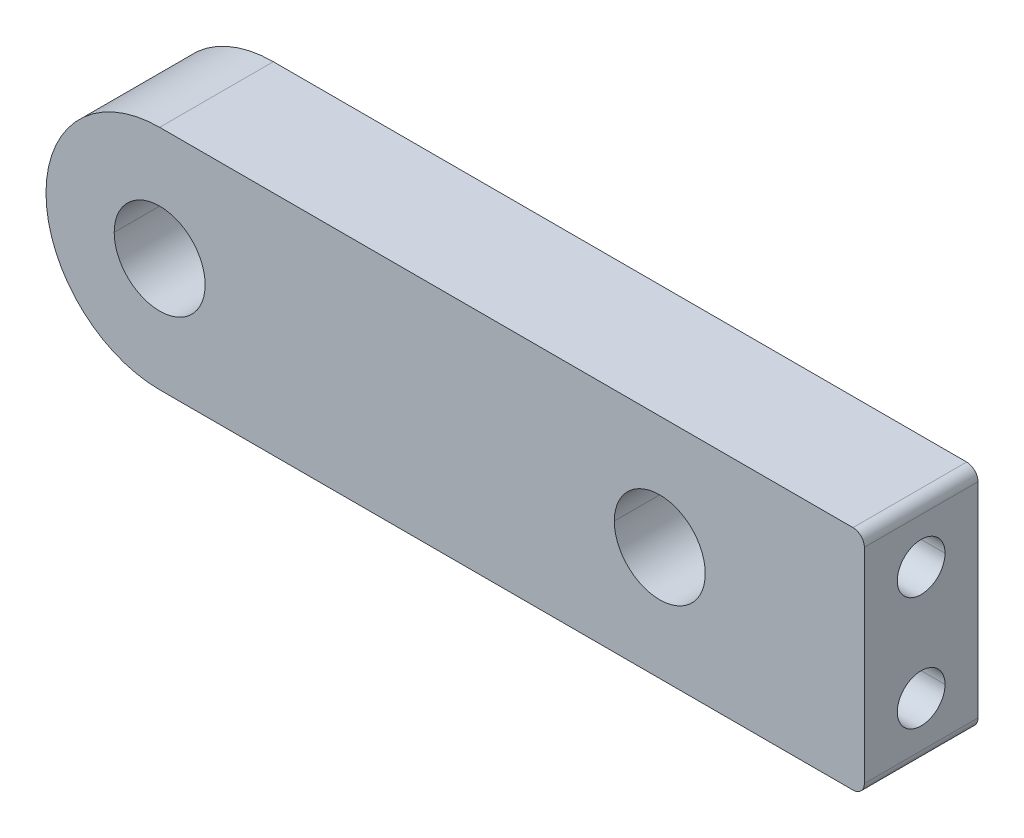
ISO-10303-21;
HEADER;
FILE_DESCRIPTION(('STEP AP214'),'2;1');
FILE_NAME('part.step','',(''),(''),'','','');
FILE_SCHEMA(('AUTOMOTIVE_DESIGN { 1 0 10303 214 1 1 1 1 }'));
ENDSEC;
DATA;
#1=APPLICATION_CONTEXT('core data for automotive mechanical design processes');
#2=APPLICATION_PROTOCOL_DEFINITION('international standard','automotive_design',2000,#1);
#3=PRODUCT_CONTEXT('',#1,'mechanical');
#4=PRODUCT('Part','Part','',(#3));
#5=PRODUCT_RELATED_PRODUCT_CATEGORY('part','',(#4));
#6=PRODUCT_DEFINITION_FORMATION('','',#4);
#7=PRODUCT_DEFINITION_CONTEXT('part definition',#1,'design');
#8=PRODUCT_DEFINITION('design','',#6,#7);
#9=PRODUCT_DEFINITION_SHAPE('','',#8);
#10=(LENGTH_UNIT() NAMED_UNIT(*) SI_UNIT(.MILLI.,.METRE.));
#11=(NAMED_UNIT(*) PLANE_ANGLE_UNIT() SI_UNIT($,.RADIAN.));
#12=(NAMED_UNIT(*) SI_UNIT($,.STERADIAN.) SOLID_ANGLE_UNIT());
#13=UNCERTAINTY_MEASURE_WITH_UNIT(LENGTH_MEASURE(1.E-05),#10,'distance_accuracy_value','');
#14=(GEOMETRIC_REPRESENTATION_CONTEXT(3) GLOBAL_UNCERTAINTY_ASSIGNED_CONTEXT((#13)) GLOBAL_UNIT_ASSIGNED_CONTEXT((#10,
#11,#12)) REPRESENTATION_CONTEXT('',''));
#15=CARTESIAN_POINT('',(0.,0.,0.));
#16=DIRECTION('',(0.,0.,1.));
#17=DIRECTION('',(1.,0.,0.));
#18=AXIS2_PLACEMENT_3D('',#15,#16,#17);
#19=CARTESIAN_POINT('',(71.,19.,10.));
#20=DIRECTION('',(0.,0.,-1.));
#21=DIRECTION('',(-1.,0.,0.));
#22=AXIS2_PLACEMENT_3D('',#19,#20,#21);
#23=CYLINDRICAL_SURFACE('',#22,1.);
#24=CARTESIAN_POINT('',(71.,19.,10.));
#25=DIRECTION('',(0.,0.,1.));
#26=DIRECTION('',(1.,0.,0.));
#27=AXIS2_PLACEMENT_3D('',#24,#25,#26);
#28=CIRCLE('',#27,1.);
#29=CARTESIAN_POINT('',(72.,19.,10.));
#30=VERTEX_POINT('',#29);
#31=CARTESIAN_POINT('',(71.,20.,10.));
#32=VERTEX_POINT('',#31);
#33=EDGE_CURVE('E256',#30,#32,#28,.T.);
#34=ORIENTED_EDGE('',*,*,#33,.F.);
#35=DIRECTION('',(0.,0.,1.));
#36=VECTOR('',#35,1.);
#37=CARTESIAN_POINT('',(72.,19.,10.));
#38=LINE('',#37,#36);
#39=CARTESIAN_POINT('',(72.,19.,0.));
#40=VERTEX_POINT('',#39);
#41=EDGE_CURVE('E218',#40,#30,#38,.T.);
#42=ORIENTED_EDGE('',*,*,#41,.F.);
#43=CARTESIAN_POINT('',(71.,19.,0.));
#44=DIRECTION('',(0.,0.,-1.));
#45=DIRECTION('',(1.,0.,0.));
#46=AXIS2_PLACEMENT_3D('',#43,#44,#45);
#47=CIRCLE('',#46,1.);
#48=CARTESIAN_POINT('',(71.,20.,0.));
#49=VERTEX_POINT('',#48);
#50=EDGE_CURVE('E275',#49,#40,#47,.T.);
#51=ORIENTED_EDGE('',*,*,#50,.F.);
#52=DIRECTION('',(0.,0.,-1.));
#53=VECTOR('',#52,1.);
#54=CARTESIAN_POINT('',(71.,20.,10.));
#55=LINE('',#54,#53);
#56=EDGE_CURVE('E196',#32,#49,#55,.T.);
#57=ORIENTED_EDGE('',*,*,#56,.F.);
#58=EDGE_LOOP('',(#34,#42,#51,#57));
#59=FACE_BOUND('',#58,.T.);
#60=ADVANCED_FACE('F17',(#59),#23,.T.);
#61=CARTESIAN_POINT('',(71.,1.,10.));
#62=DIRECTION('',(0.,0.,1.));
#63=DIRECTION('',(1.,0.,0.));
#64=AXIS2_PLACEMENT_3D('',#61,#62,#63);
#65=CYLINDRICAL_SURFACE('',#64,1.);
#66=CARTESIAN_POINT('',(71.,1.,10.));
#67=DIRECTION('',(0.,0.,1.));
#68=DIRECTION('',(1.,0.,0.));
#69=AXIS2_PLACEMENT_3D('',#66,#67,#68);
#70=CIRCLE('',#69,1.);
#71=CARTESIAN_POINT('',(71.,0.,10.));
#72=VERTEX_POINT('',#71);
#73=CARTESIAN_POINT('',(72.,1.,10.));
#74=VERTEX_POINT('',#73);
#75=EDGE_CURVE('E255',#72,#74,#70,.T.);
#76=ORIENTED_EDGE('',*,*,#75,.F.);
#77=DIRECTION('',(0.,0.,1.));
#78=VECTOR('',#77,1.);
#79=CARTESIAN_POINT('',(71.,0.,10.));
#80=LINE('',#79,#78);
#81=CARTESIAN_POINT('',(71.,0.,0.));
#82=VERTEX_POINT('',#81);
#83=EDGE_CURVE('E243',#82,#72,#80,.T.);
#84=ORIENTED_EDGE('',*,*,#83,.F.);
#85=CARTESIAN_POINT('',(71.,1.,0.));
#86=DIRECTION('',(0.,0.,-1.));
#87=DIRECTION('',(1.,0.,0.));
#88=AXIS2_PLACEMENT_3D('',#85,#86,#87);
#89=CIRCLE('',#88,1.);
#90=CARTESIAN_POINT('',(72.,1.,0.));
#91=VERTEX_POINT('',#90);
#92=EDGE_CURVE('E266',#91,#82,#89,.T.);
#93=ORIENTED_EDGE('',*,*,#92,.F.);
#94=DIRECTION('',(0.,0.,-1.));
#95=VECTOR('',#94,1.);
#96=CARTESIAN_POINT('',(72.,1.,0.));
#97=LINE('',#96,#95);
#98=EDGE_CURVE('E209',#74,#91,#97,.T.);
#99=ORIENTED_EDGE('',*,*,#98,.F.);
#100=EDGE_LOOP('',(#76,#84,#93,#99));
#101=FACE_BOUND('',#100,.T.);
#102=ADVANCED_FACE('F323',(#101),#65,.T.);
#103=CARTESIAN_POINT('',(72.,15.,5.));
#104=DIRECTION('',(1.,0.,0.));
#105=DIRECTION('',(0.,0.,-1.));
#106=AXIS2_PLACEMENT_3D('',#103,#104,#105);
#107=CYLINDRICAL_SURFACE('',#106,2.1);
#108=DIRECTION('',(1.,0.,0.));
#109=VECTOR('',#108,1.);
#110=CARTESIAN_POINT('',(72.,15.,7.1));
#111=LINE('',#110,#109);
#112=CARTESIAN_POINT('',(58.,15.,7.1));
#113=VERTEX_POINT('',#112);
#114=CARTESIAN_POINT('',(72.,15.,7.1));
#115=VERTEX_POINT('',#114);
#116=EDGE_CURVE('E352',#113,#115,#111,.T.);
#117=ORIENTED_EDGE('',*,*,#116,.F.);
#118=CARTESIAN_POINT('',(58.,15.,5.));
#119=DIRECTION('',(1.,0.,0.));
#120=DIRECTION('',(0.,0.,-1.));
#121=AXIS2_PLACEMENT_3D('',#118,#119,#120);
#122=CIRCLE('',#121,2.1);
#123=CARTESIAN_POINT('',(58.,15.,2.9));
#124=VERTEX_POINT('',#123);
#125=EDGE_CURVE('E11',#124,#113,#122,.T.);
#126=ORIENTED_EDGE('',*,*,#125,.F.);
#127=DIRECTION('',(1.,0.,0.));
#128=VECTOR('',#127,1.);
#129=CARTESIAN_POINT('',(72.,15.,2.9));
#130=LINE('',#129,#128);
#131=CARTESIAN_POINT('',(72.,15.,2.9));
#132=VERTEX_POINT('',#131);
#133=EDGE_CURVE('E302',#124,#132,#130,.T.);
#134=ORIENTED_EDGE('',*,*,#133,.T.);
#135=CARTESIAN_POINT('',(72.,15.,5.));
#136=DIRECTION('',(1.,0.,0.));
#137=DIRECTION('',(0.,0.,-1.));
#138=AXIS2_PLACEMENT_3D('',#135,#136,#137);
#139=CIRCLE('',#138,2.1);
#140=EDGE_CURVE('E222',#132,#115,#139,.T.);
#141=ORIENTED_EDGE('',*,*,#140,.T.);
#142=EDGE_LOOP('',(#117,#126,#134,#141));
#143=FACE_BOUND('',#142,.T.);
#144=ADVANCED_FACE('F389',(#143),#107,.F.);
#145=CARTESIAN_POINT('',(58.,15.,5.));
#146=DIRECTION('',(-1.,0.,0.));
#147=DIRECTION('',(0.,0.,1.));
#148=AXIS2_PLACEMENT_3D('',#145,#146,#147);
#149=PLANE('',#148);
#150=ORIENTED_EDGE('',*,*,#125,.T.);
#151=CARTESIAN_POINT('',(58.,15.,5.));
#152=DIRECTION('',(1.,0.,0.));
#153=DIRECTION('',(0.,0.,-1.));
#154=AXIS2_PLACEMENT_3D('',#151,#152,#153);
#155=CIRCLE('',#154,2.1);
#156=EDGE_CURVE('E351',#113,#124,#155,.T.);
#157=ORIENTED_EDGE('',*,*,#156,.T.);
#158=EDGE_LOOP('',(#150,#157));
#159=FACE_BOUND('',#158,.T.);
#160=ADVANCED_FACE('F515',(#159),#149,.F.);
#161=CARTESIAN_POINT('',(72.,5.,5.));
#162=DIRECTION('',(1.,0.,0.));
#163=DIRECTION('',(0.,0.,-1.));
#164=AXIS2_PLACEMENT_3D('',#161,#162,#163);
#165=CYLINDRICAL_SURFACE('',#164,2.1);
#166=DIRECTION('',(1.,0.,0.));
#167=VECTOR('',#166,1.);
#168=CARTESIAN_POINT('',(72.,5.,7.1));
#169=LINE('',#168,#167);
#170=CARTESIAN_POINT('',(58.,5.,7.1));
#171=VERTEX_POINT('',#170);
#172=CARTESIAN_POINT('',(72.,5.,7.1));
#173=VERTEX_POINT('',#172);
#174=EDGE_CURVE('E293',#171,#173,#169,.T.);
#175=ORIENTED_EDGE('',*,*,#174,.F.);
#176=CARTESIAN_POINT('',(58.,5.,5.));
#177=DIRECTION('',(1.,0.,0.));
#178=DIRECTION('',(0.,0.,-1.));
#179=AXIS2_PLACEMENT_3D('',#176,#177,#178);
#180=CIRCLE('',#179,2.1);
#181=CARTESIAN_POINT('',(58.,5.,2.9));
#182=VERTEX_POINT('',#181);
#183=EDGE_CURVE('E20',#182,#171,#180,.T.);
#184=ORIENTED_EDGE('',*,*,#183,.F.);
#185=DIRECTION('',(1.,0.,0.));
#186=VECTOR('',#185,1.);
#187=CARTESIAN_POINT('',(72.,5.,2.9));
#188=LINE('',#187,#186);
#189=CARTESIAN_POINT('',(72.,5.,2.9));
#190=VERTEX_POINT('',#189);
#191=EDGE_CURVE('E184',#182,#190,#188,.T.);
#192=ORIENTED_EDGE('',*,*,#191,.T.);
#193=CARTESIAN_POINT('',(72.,5.,5.));
#194=DIRECTION('',(1.,0.,0.));
#195=DIRECTION('',(0.,0.,-1.));
#196=AXIS2_PLACEMENT_3D('',#193,#194,#195);
#197=CIRCLE('',#196,2.1);
#198=EDGE_CURVE('E225',#190,#173,#197,.T.);
#199=ORIENTED_EDGE('',*,*,#198,.T.);
#200=EDGE_LOOP('',(#175,#184,#192,#199));
#201=FACE_BOUND('',#200,.T.);
#202=ADVANCED_FACE('F294',(#201),#165,.F.);
#203=CARTESIAN_POINT('',(58.,5.,5.));
#204=DIRECTION('',(-1.,0.,0.));
#205=DIRECTION('',(0.,0.,1.));
#206=AXIS2_PLACEMENT_3D('',#203,#204,#205);
#207=PLANE('',#206);
#208=ORIENTED_EDGE('',*,*,#183,.T.);
#209=CARTESIAN_POINT('',(58.,5.,5.));
#210=DIRECTION('',(1.,0.,0.));
#211=DIRECTION('',(0.,0.,-1.));
#212=AXIS2_PLACEMENT_3D('',#209,#210,#211);
#213=CIRCLE('',#212,2.1);
#214=EDGE_CURVE('E289',#171,#182,#213,.T.);
#215=ORIENTED_EDGE('',*,*,#214,.T.);
#216=EDGE_LOOP('',(#208,#215));
#217=FACE_BOUND('',#216,.T.);
#218=ADVANCED_FACE('F287',(#217),#207,.F.);
#219=CARTESIAN_POINT('',(10.,10.,10.));
#220=DIRECTION('',(0.,0.,-1.));
#221=DIRECTION('',(-1.,0.,0.));
#222=AXIS2_PLACEMENT_3D('',#219,#220,#221);
#223=CYLINDRICAL_SURFACE('',#222,10.);
#224=CARTESIAN_POINT('',(10.,10.,10.));
#225=DIRECTION('',(0.,0.,1.));
#226=DIRECTION('',(1.,0.,0.));
#227=AXIS2_PLACEMENT_3D('',#224,#225,#226);
#228=CIRCLE('',#227,10.);
#229=CARTESIAN_POINT('',(0.,10.,10.));
#230=VERTEX_POINT('',#229);
#231=CARTESIAN_POINT('',(10.,0.,10.));
#232=VERTEX_POINT('',#231);
#233=EDGE_CURVE('E263',#230,#232,#228,.T.);
#234=ORIENTED_EDGE('',*,*,#233,.F.);
#235=DIRECTION('',(0.,0.,-1.));
#236=VECTOR('',#235,1.);
#237=CARTESIAN_POINT('',(0.,10.,0.));
#238=LINE('',#237,#236);
#239=CARTESIAN_POINT('',(0.,10.,0.));
#240=VERTEX_POINT('',#239);
#241=EDGE_CURVE('E39',#230,#240,#238,.T.);
#242=ORIENTED_EDGE('',*,*,#241,.T.);
#243=CARTESIAN_POINT('',(10.,10.,0.));
#244=DIRECTION('',(0.,0.,-1.));
#245=DIRECTION('',(1.,0.,0.));
#246=AXIS2_PLACEMENT_3D('',#243,#244,#245);
#247=CIRCLE('',#246,10.);
#248=CARTESIAN_POINT('',(10.,0.,0.));
#249=VERTEX_POINT('',#248);
#250=EDGE_CURVE('E269',#249,#240,#247,.T.);
#251=ORIENTED_EDGE('',*,*,#250,.F.);
#252=DIRECTION('',(0.,0.,-1.));
#253=VECTOR('',#252,1.);
#254=CARTESIAN_POINT('',(10.,0.,10.));
#255=LINE('',#254,#253);
#256=EDGE_CURVE('E251',#232,#249,#255,.T.);
#257=ORIENTED_EDGE('',*,*,#256,.F.);
#258=EDGE_LOOP('',(#234,#242,#251,#257));
#259=FACE_BOUND('',#258,.T.);
#260=ADVANCED_FACE('F536',(#259),#223,.T.);
#261=CARTESIAN_POINT('',(10.,10.,10.));
#262=DIRECTION('',(0.,0.,1.));
#263=DIRECTION('',(1.,0.,0.));
#264=AXIS2_PLACEMENT_3D('',#261,#262,#263);
#265=CYLINDRICAL_SURFACE('',#264,10.);
#266=ORIENTED_EDGE('',*,*,#241,.F.);
#267=CARTESIAN_POINT('',(10.,10.,10.));
#268=DIRECTION('',(0.,0.,1.));
#269=DIRECTION('',(1.,0.,0.));
#270=AXIS2_PLACEMENT_3D('',#267,#268,#269);
#271=CIRCLE('',#270,10.);
#272=CARTESIAN_POINT('',(10.,20.,10.));
#273=VERTEX_POINT('',#272);
#274=EDGE_CURVE('E259',#273,#230,#271,.T.);
#275=ORIENTED_EDGE('',*,*,#274,.F.);
#276=DIRECTION('',(0.,0.,1.));
#277=VECTOR('',#276,1.);
#278=CARTESIAN_POINT('',(10.,20.,10.));
#279=LINE('',#278,#277);
#280=CARTESIAN_POINT('',(10.,20.,0.));
#281=VERTEX_POINT('',#280);
#282=EDGE_CURVE('E228',#281,#273,#279,.T.);
#283=ORIENTED_EDGE('',*,*,#282,.F.);
#284=CARTESIAN_POINT('',(10.,10.,0.));
#285=DIRECTION('',(0.,0.,-1.));
#286=DIRECTION('',(1.,0.,0.));
#287=AXIS2_PLACEMENT_3D('',#284,#285,#286);
#288=CIRCLE('',#287,10.);
#289=EDGE_CURVE('E273',#240,#281,#288,.T.);
#290=ORIENTED_EDGE('',*,*,#289,.F.);
#291=EDGE_LOOP('',(#266,#275,#283,#290));
#292=FACE_BOUND('',#291,.T.);
#293=ADVANCED_FACE('F381',(#292),#265,.T.);
#294=CARTESIAN_POINT('',(0.,0.,0.));
#295=DIRECTION('',(0.,0.,1.));
#296=DIRECTION('',(1.,0.,0.));
#297=AXIS2_PLACEMENT_3D('',#294,#295,#296);
#298=PLANE('',#297);
#299=CARTESIAN_POINT('',(10.,10.,0.));
#300=DIRECTION('',(0.,0.,1.));
#301=DIRECTION('',(1.,0.,0.));
#302=AXIS2_PLACEMENT_3D('',#299,#300,#301);
#303=CIRCLE('',#302,4.);
#304=CARTESIAN_POINT('',(6.,10.,0.));
#305=VERTEX_POINT('',#304);
#306=CARTESIAN_POINT('',(14.,10.,0.));
#307=VERTEX_POINT('',#306);
#308=EDGE_CURVE('E207',#305,#307,#303,.T.);
#309=ORIENTED_EDGE('',*,*,#308,.T.);
#310=CARTESIAN_POINT('',(10.,10.,0.));
#311=DIRECTION('',(0.,0.,1.));
#312=DIRECTION('',(1.,0.,0.));
#313=AXIS2_PLACEMENT_3D('',#310,#311,#312);
#314=CIRCLE('',#313,4.);
#315=EDGE_CURVE('E170',#307,#305,#314,.T.);
#316=ORIENTED_EDGE('',*,*,#315,.T.);
#317=EDGE_LOOP('',(#309,#316));
#318=FACE_BOUND('',#317,.T.);
#319=CARTESIAN_POINT('',(54.,10.,0.));
#320=DIRECTION('',(0.,0.,1.));
#321=DIRECTION('',(1.,0.,0.));
#322=AXIS2_PLACEMENT_3D('',#319,#320,#321);
#323=CIRCLE('',#322,4.);
#324=CARTESIAN_POINT('',(50.,10.,0.));
#325=VERTEX_POINT('',#324);
#326=CARTESIAN_POINT('',(58.,10.,0.));
#327=VERTEX_POINT('',#326);
#328=EDGE_CURVE('E179',#325,#327,#323,.T.);
#329=ORIENTED_EDGE('',*,*,#328,.T.);
#330=CARTESIAN_POINT('',(54.,10.,0.));
#331=DIRECTION('',(0.,0.,1.));
#332=DIRECTION('',(1.,0.,0.));
#333=AXIS2_PLACEMENT_3D('',#330,#331,#332);
#334=CIRCLE('',#333,4.);
#335=EDGE_CURVE('E169',#327,#325,#334,.T.);
#336=ORIENTED_EDGE('',*,*,#335,.T.);
#337=EDGE_LOOP('',(#329,#336));
#338=FACE_BOUND('',#337,.T.);
#339=DIRECTION('',(0.,-1.,0.));
#340=VECTOR('',#339,1.);
#341=CARTESIAN_POINT('',(72.,0.,0.));
#342=LINE('',#341,#340);
#343=EDGE_CURVE('E213',#40,#91,#342,.T.);
#344=ORIENTED_EDGE('',*,*,#343,.T.);
#345=ORIENTED_EDGE('',*,*,#92,.T.);
#346=DIRECTION('',(1.,0.,0.));
#347=VECTOR('',#346,1.);
#348=CARTESIAN_POINT('',(0.,0.,0.));
#349=LINE('',#348,#347);
#350=EDGE_CURVE('E239',#249,#82,#349,.T.);
#351=ORIENTED_EDGE('',*,*,#350,.F.);
#352=ORIENTED_EDGE('',*,*,#250,.T.);
#353=ORIENTED_EDGE('',*,*,#289,.T.);
#354=DIRECTION('',(1.,0.,0.));
#355=VECTOR('',#354,1.);
#356=CARTESIAN_POINT('',(0.,20.,0.));
#357=LINE('',#356,#355);
#358=EDGE_CURVE('E200',#281,#49,#357,.T.);
#359=ORIENTED_EDGE('',*,*,#358,.T.);
#360=ORIENTED_EDGE('',*,*,#50,.T.);
#361=EDGE_LOOP('',(#344,#345,#351,#352,#353,#359,#360));
#362=FACE_BOUND('',#361,.T.);
#363=ADVANCED_FACE('F364',(#318,#338,#362),#298,.F.);
#364=CARTESIAN_POINT('',(0.,0.,10.));
#365=DIRECTION('',(0.,0.,1.));
#366=DIRECTION('',(1.,0.,0.));
#367=AXIS2_PLACEMENT_3D('',#364,#365,#366);
#368=PLANE('',#367);
#369=CARTESIAN_POINT('',(10.,10.,10.));
#370=DIRECTION('',(0.,0.,1.));
#371=DIRECTION('',(1.,0.,0.));
#372=AXIS2_PLACEMENT_3D('',#369,#370,#371);
#373=CIRCLE('',#372,4.);
#374=CARTESIAN_POINT('',(6.,10.,10.));
#375=VERTEX_POINT('',#374);
#376=CARTESIAN_POINT('',(14.,10.,10.));
#377=VERTEX_POINT('',#376);
#378=EDGE_CURVE('E208',#375,#377,#373,.T.);
#379=ORIENTED_EDGE('',*,*,#378,.F.);
#380=CARTESIAN_POINT('',(10.,10.,10.));
#381=DIRECTION('',(0.,0.,1.));
#382=DIRECTION('',(1.,0.,0.));
#383=AXIS2_PLACEMENT_3D('',#380,#381,#382);
#384=CIRCLE('',#383,4.);
#385=EDGE_CURVE('E232',#377,#375,#384,.T.);
#386=ORIENTED_EDGE('',*,*,#385,.F.);
#387=EDGE_LOOP('',(#379,#386));
#388=FACE_BOUND('',#387,.T.);
#389=CARTESIAN_POINT('',(54.,10.,10.));
#390=DIRECTION('',(0.,0.,1.));
#391=DIRECTION('',(1.,0.,0.));
#392=AXIS2_PLACEMENT_3D('',#389,#390,#391);
#393=CIRCLE('',#392,4.);
#394=CARTESIAN_POINT('',(50.,10.,10.));
#395=VERTEX_POINT('',#394);
#396=CARTESIAN_POINT('',(58.,10.,10.));
#397=VERTEX_POINT('',#396);
#398=EDGE_CURVE('E164',#395,#397,#393,.T.);
#399=ORIENTED_EDGE('',*,*,#398,.F.);
#400=CARTESIAN_POINT('',(54.,10.,10.));
#401=DIRECTION('',(0.,0.,1.));
#402=DIRECTION('',(1.,0.,0.));
#403=AXIS2_PLACEMENT_3D('',#400,#401,#402);
#404=CIRCLE('',#403,4.);
#405=EDGE_CURVE('E159',#397,#395,#404,.T.);
#406=ORIENTED_EDGE('',*,*,#405,.F.);
#407=EDGE_LOOP('',(#399,#406));
#408=FACE_BOUND('',#407,.T.);
#409=DIRECTION('',(1.,0.,0.));
#410=VECTOR('',#409,1.);
#411=CARTESIAN_POINT('',(0.,0.,10.));
#412=LINE('',#411,#410);
#413=EDGE_CURVE('E247',#232,#72,#412,.T.);
#414=ORIENTED_EDGE('',*,*,#413,.T.);
#415=ORIENTED_EDGE('',*,*,#75,.T.);
#416=DIRECTION('',(0.,-1.,0.));
#417=VECTOR('',#416,1.);
#418=CARTESIAN_POINT('',(72.,0.,10.));
#419=LINE('',#418,#417);
#420=EDGE_CURVE('E214',#30,#74,#419,.T.);
#421=ORIENTED_EDGE('',*,*,#420,.F.);
#422=ORIENTED_EDGE('',*,*,#33,.T.);
#423=DIRECTION('',(1.,0.,0.));
#424=VECTOR('',#423,1.);
#425=CARTESIAN_POINT('',(0.,20.,10.));
#426=LINE('',#425,#424);
#427=EDGE_CURVE('E195',#273,#32,#426,.T.);
#428=ORIENTED_EDGE('',*,*,#427,.F.);
#429=ORIENTED_EDGE('',*,*,#274,.T.);
#430=ORIENTED_EDGE('',*,*,#233,.T.);
#431=EDGE_LOOP('',(#414,#415,#421,#422,#428,#429,#430));
#432=FACE_BOUND('',#431,.T.);
#433=ADVANCED_FACE('F161',(#388,#408,#432),#368,.T.);
#434=CARTESIAN_POINT('',(0.,0.,10.));
#435=DIRECTION('',(0.,1.,0.));
#436=DIRECTION('',(1.,0.,0.));
#437=AXIS2_PLACEMENT_3D('',#434,#435,#436);
#438=PLANE('',#437);
#439=ORIENTED_EDGE('',*,*,#350,.T.);
#440=ORIENTED_EDGE('',*,*,#83,.T.);
#441=ORIENTED_EDGE('',*,*,#413,.F.);
#442=ORIENTED_EDGE('',*,*,#256,.T.);
#443=EDGE_LOOP('',(#439,#440,#441,#442));
#444=FACE_BOUND('',#443,.T.);
#445=ADVANCED_FACE('F372',(#444),#438,.F.);
#446=CARTESIAN_POINT('',(54.,10.,10.));
#447=DIRECTION('',(0.,0.,-1.));
#448=DIRECTION('',(-1.,0.,0.));
#449=AXIS2_PLACEMENT_3D('',#446,#447,#448);
#450=CYLINDRICAL_SURFACE('',#449,4.);
#451=DIRECTION('',(0.,0.,-1.));
#452=VECTOR('',#451,1.);
#453=CARTESIAN_POINT('',(58.,10.,10.));
#454=LINE('',#453,#452);
#455=EDGE_CURVE('E173',#397,#327,#454,.T.);
#456=ORIENTED_EDGE('',*,*,#455,.F.);
#457=ORIENTED_EDGE('',*,*,#405,.T.);
#458=DIRECTION('',(0.,0.,-1.));
#459=VECTOR('',#458,1.);
#460=CARTESIAN_POINT('',(50.,10.,10.));
#461=LINE('',#460,#459);
#462=EDGE_CURVE('E182',#395,#325,#461,.T.);
#463=ORIENTED_EDGE('',*,*,#462,.T.);
#464=ORIENTED_EDGE('',*,*,#335,.F.);
#465=EDGE_LOOP('',(#456,#457,#463,#464));
#466=FACE_BOUND('',#465,.T.);
#467=ADVANCED_FACE('F174',(#466),#450,.F.);
#468=CARTESIAN_POINT('',(10.,10.,10.));
#469=DIRECTION('',(0.,0.,-1.));
#470=DIRECTION('',(-1.,0.,0.));
#471=AXIS2_PLACEMENT_3D('',#468,#469,#470);
#472=CYLINDRICAL_SURFACE('',#471,4.);
#473=DIRECTION('',(0.,0.,-1.));
#474=VECTOR('',#473,1.);
#475=CARTESIAN_POINT('',(14.,10.,10.));
#476=LINE('',#475,#474);
#477=EDGE_CURVE('E203',#377,#307,#476,.T.);
#478=ORIENTED_EDGE('',*,*,#477,.F.);
#479=ORIENTED_EDGE('',*,*,#385,.T.);
#480=DIRECTION('',(0.,0.,-1.));
#481=VECTOR('',#480,1.);
#482=CARTESIAN_POINT('',(6.,10.,10.));
#483=LINE('',#482,#481);
#484=EDGE_CURVE('E329',#375,#305,#483,.T.);
#485=ORIENTED_EDGE('',*,*,#484,.T.);
#486=ORIENTED_EDGE('',*,*,#315,.F.);
#487=EDGE_LOOP('',(#478,#479,#485,#486));
#488=FACE_BOUND('',#487,.T.);
#489=ADVANCED_FACE('F369',(#488),#472,.F.);
#490=CARTESIAN_POINT('',(0.,20.,10.));
#491=DIRECTION('',(0.,1.,0.));
#492=DIRECTION('',(1.,0.,0.));
#493=AXIS2_PLACEMENT_3D('',#490,#491,#492);
#494=PLANE('',#493);
#495=ORIENTED_EDGE('',*,*,#427,.T.);
#496=ORIENTED_EDGE('',*,*,#56,.T.);
#497=ORIENTED_EDGE('',*,*,#358,.F.);
#498=ORIENTED_EDGE('',*,*,#282,.T.);
#499=EDGE_LOOP('',(#495,#496,#497,#498));
#500=FACE_BOUND('',#499,.T.);
#501=ADVANCED_FACE('F524',(#500),#494,.T.);
#502=CARTESIAN_POINT('',(72.,0.,10.));
#503=DIRECTION('',(1.,0.,0.));
#504=DIRECTION('',(0.,1.,0.));
#505=AXIS2_PLACEMENT_3D('',#502,#503,#504);
#506=PLANE('',#505);
#507=ORIENTED_EDGE('',*,*,#198,.F.);
#508=CARTESIAN_POINT('',(72.,5.,5.));
#509=DIRECTION('',(1.,0.,0.));
#510=DIRECTION('',(0.,0.,-1.));
#511=AXIS2_PLACEMENT_3D('',#508,#509,#510);
#512=CIRCLE('',#511,2.1);
#513=EDGE_CURVE('E191',#173,#190,#512,.T.);
#514=ORIENTED_EDGE('',*,*,#513,.F.);
#515=EDGE_LOOP('',(#507,#514));
#516=FACE_BOUND('',#515,.T.);
#517=ORIENTED_EDGE('',*,*,#140,.F.);
#518=CARTESIAN_POINT('',(72.,15.,5.));
#519=DIRECTION('',(1.,0.,0.));
#520=DIRECTION('',(0.,0.,-1.));
#521=AXIS2_PLACEMENT_3D('',#518,#519,#520);
#522=CIRCLE('',#521,2.1);
#523=EDGE_CURVE('E308',#115,#132,#522,.T.);
#524=ORIENTED_EDGE('',*,*,#523,.F.);
#525=EDGE_LOOP('',(#517,#524));
#526=FACE_BOUND('',#525,.T.);
#527=ORIENTED_EDGE('',*,*,#420,.T.);
#528=ORIENTED_EDGE('',*,*,#98,.T.);
#529=ORIENTED_EDGE('',*,*,#343,.F.);
#530=ORIENTED_EDGE('',*,*,#41,.T.);
#531=EDGE_LOOP('',(#527,#528,#529,#530));
#532=FACE_BOUND('',#531,.T.);
#533=ADVANCED_FACE('F326',(#516,#526,#532),#506,.T.);
#534=CARTESIAN_POINT('',(10.,10.,10.));
#535=DIRECTION('',(0.,0.,-1.));
#536=DIRECTION('',(-1.,0.,0.));
#537=AXIS2_PLACEMENT_3D('',#534,#535,#536);
#538=CYLINDRICAL_SURFACE('',#537,4.);
#539=ORIENTED_EDGE('',*,*,#378,.T.);
#540=ORIENTED_EDGE('',*,*,#477,.T.);
#541=ORIENTED_EDGE('',*,*,#308,.F.);
#542=ORIENTED_EDGE('',*,*,#484,.F.);
#543=EDGE_LOOP('',(#539,#540,#541,#542));
#544=FACE_BOUND('',#543,.T.);
#545=ADVANCED_FACE('F367',(#544),#538,.F.);
#546=CARTESIAN_POINT('',(54.,10.,10.));
#547=DIRECTION('',(0.,0.,-1.));
#548=DIRECTION('',(-1.,0.,0.));
#549=AXIS2_PLACEMENT_3D('',#546,#547,#548);
#550=CYLINDRICAL_SURFACE('',#549,4.);
#551=ORIENTED_EDGE('',*,*,#398,.T.);
#552=ORIENTED_EDGE('',*,*,#455,.T.);
#553=ORIENTED_EDGE('',*,*,#328,.F.);
#554=ORIENTED_EDGE('',*,*,#462,.F.);
#555=EDGE_LOOP('',(#551,#552,#553,#554));
#556=FACE_BOUND('',#555,.T.);
#557=ADVANCED_FACE('F181',(#556),#550,.F.);
#558=CARTESIAN_POINT('',(72.,5.,5.));
#559=DIRECTION('',(1.,0.,0.));
#560=DIRECTION('',(0.,0.,-1.));
#561=AXIS2_PLACEMENT_3D('',#558,#559,#560);
#562=CYLINDRICAL_SURFACE('',#561,2.1);
#563=ORIENTED_EDGE('',*,*,#214,.F.);
#564=ORIENTED_EDGE('',*,*,#174,.T.);
#565=ORIENTED_EDGE('',*,*,#513,.T.);
#566=ORIENTED_EDGE('',*,*,#191,.F.);
#567=EDGE_LOOP('',(#563,#564,#565,#566));
#568=FACE_BOUND('',#567,.T.);
#569=ADVANCED_FACE('F300',(#568),#562,.F.);
#570=CARTESIAN_POINT('',(72.,15.,5.));
#571=DIRECTION('',(1.,0.,0.));
#572=DIRECTION('',(0.,0.,-1.));
#573=AXIS2_PLACEMENT_3D('',#570,#571,#572);
#574=CYLINDRICAL_SURFACE('',#573,2.1);
#575=ORIENTED_EDGE('',*,*,#156,.F.);
#576=ORIENTED_EDGE('',*,*,#116,.T.);
#577=ORIENTED_EDGE('',*,*,#523,.T.);
#578=ORIENTED_EDGE('',*,*,#133,.F.);
#579=EDGE_LOOP('',(#575,#576,#577,#578));
#580=FACE_BOUND('',#579,.T.);
#581=ADVANCED_FACE('F519',(#580),#574,.F.);
#582=CLOSED_SHELL('',(#60,#102,#144,#160,#202,#218,#260,#293,#363,#433,#445,#467,#489,#501,#533,
#545,#557,#569,#581));
#583=MANIFOLD_SOLID_BREP('B1',#582);
#584=ADVANCED_BREP_SHAPE_REPRESENTATION('',(#18,#583),#14);
#585=SHAPE_DEFINITION_REPRESENTATION(#9,#584);
ENDSEC;
END-ISO-10303-21;
